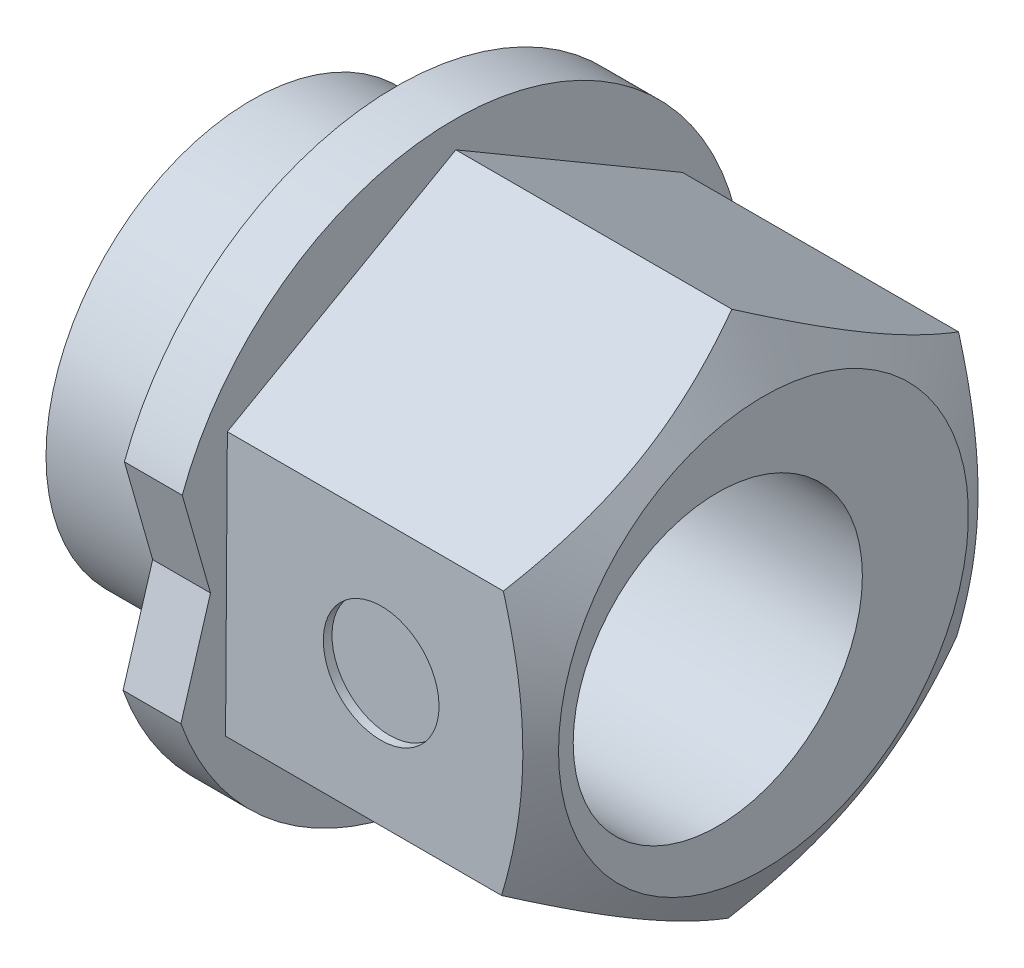
ISO-10303-21;
HEADER;
FILE_DESCRIPTION(('STEP AP214'),'2;1');
FILE_NAME('part.step','',(''),(''),'','','');
FILE_SCHEMA(('AUTOMOTIVE_DESIGN { 1 0 10303 214 1 1 1 1 }'));
ENDSEC;
DATA;
#1=APPLICATION_CONTEXT('core data for automotive mechanical design processes');
#2=APPLICATION_PROTOCOL_DEFINITION('international standard','automotive_design',2000,#1);
#3=PRODUCT_CONTEXT('',#1,'mechanical');
#4=PRODUCT('Part','Part','',(#3));
#5=PRODUCT_RELATED_PRODUCT_CATEGORY('part','',(#4));
#6=PRODUCT_DEFINITION_FORMATION('','',#4);
#7=PRODUCT_DEFINITION_CONTEXT('part definition',#1,'design');
#8=PRODUCT_DEFINITION('design','',#6,#7);
#9=PRODUCT_DEFINITION_SHAPE('','',#8);
#10=(LENGTH_UNIT() NAMED_UNIT(*) SI_UNIT(.MILLI.,.METRE.));
#11=(NAMED_UNIT(*) PLANE_ANGLE_UNIT() SI_UNIT($,.RADIAN.));
#12=(NAMED_UNIT(*) SI_UNIT($,.STERADIAN.) SOLID_ANGLE_UNIT());
#13=UNCERTAINTY_MEASURE_WITH_UNIT(LENGTH_MEASURE(1.E-05),#10,'distance_accuracy_value','');
#14=(GEOMETRIC_REPRESENTATION_CONTEXT(3) GLOBAL_UNCERTAINTY_ASSIGNED_CONTEXT((#13)) GLOBAL_UNIT_ASSIGNED_CONTEXT((#10,
#11,#12)) REPRESENTATION_CONTEXT('',''));
#15=CARTESIAN_POINT('',(0.,0.,0.));
#16=DIRECTION('',(0.,0.,1.));
#17=DIRECTION('',(1.,0.,0.));
#18=AXIS2_PLACEMENT_3D('',#15,#16,#17);
#19=CARTESIAN_POINT('',(5.35,-4.54364126029758,0.0309423828233433));
#20=DIRECTION('',(0.,0.869410264297968,0.494090874569989));
#21=DIRECTION('',(0.,-0.494090874569989,0.869410264297968));
#22=AXIS2_PLACEMENT_3D('',#19,#20,#21);
#23=PLANE('',#22);
#24=DIRECTION('',(0.,0.494090874569989,-0.869410264297968));
#25=VECTOR('',#24,1.);
#26=CARTESIAN_POINT('',(4.77264973081037,-4.54364126029758,0.0309423828233433));
#27=LINE('',#26,#25);
#28=CARTESIAN_POINT('',(4.77264973081037,-4.54364126029758,0.0309423828233433));
#29=VERTEX_POINT('',#28);
#30=CARTESIAN_POINT('',(4.77264973081037,-4.54353714360121,0.0307591774067416));
#31=VERTEX_POINT('',#30);
#32=EDGE_CURVE('E238',#29,#31,#27,.T.);
#33=ORIENTED_EDGE('',*,*,#32,.F.);
#34=DIRECTION('',(-1.,0.,0.));
#35=VECTOR('',#34,1.);
#36=CARTESIAN_POINT('',(5.35,-4.54364126029758,0.0309423828233433));
#37=LINE('',#36,#35);
#38=CARTESIAN_POINT('',(0.,-4.54364126029758,0.0309423828233433));
#39=VERTEX_POINT('',#38);
#40=EDGE_CURVE('E55',#29,#39,#37,.T.);
#41=ORIENTED_EDGE('',*,*,#40,.T.);
#42=DIRECTION('',(0.,0.494090874569989,-0.869410264297968));
#43=VECTOR('',#42,1.);
#44=CARTESIAN_POINT('',(0.,-4.54364126029758,0.0309423828233433));
#45=LINE('',#44,#43);
#46=CARTESIAN_POINT('',(0.,-2.29861751972745,-3.91943756568916));
#47=VERTEX_POINT('',#46);
#48=EDGE_CURVE('E291',#39,#47,#45,.T.);
#49=ORIENTED_EDGE('',*,*,#48,.T.);
#50=DIRECTION('',(-1.,0.,0.));
#51=VECTOR('',#50,1.);
#52=CARTESIAN_POINT('',(5.35,-2.29861751972745,-3.91943756568916));
#53=LINE('',#52,#51);
#54=CARTESIAN_POINT('',(4.77264973081037,-2.29861751972745,-3.91943756568916));
#55=VERTEX_POINT('',#54);
#56=EDGE_CURVE('E260',#55,#47,#53,.T.);
#57=ORIENTED_EDGE('',*,*,#56,.F.);
#58=CARTESIAN_POINT('',(4.77264973081037,-2.29872163642382,-3.91925436027257));
#59=VERTEX_POINT('',#58);
#60=EDGE_CURVE('E240',#59,#55,#27,.T.);
#61=ORIENTED_EDGE('',*,*,#60,.F.);
#62=CARTESIAN_POINT('',(4.77252249257501,-4.5437549214527,0.0311423828233432));
#63=CARTESIAN_POINT('',(4.83018446189932,-4.44509780626388,-0.14245626674864));
#64=CARTESIAN_POINT('',(4.88262583823013,-4.34558908849139,-0.317553409948926));
#65=CARTESIAN_POINT('',(4.97416259753298,-4.14484856970296,-0.67077966138911));
#66=CARTESIAN_POINT('',(5.01322559849631,-4.04361320191933,-0.848915045770918));
#67=CARTESIAN_POINT('',(5.07403259166471,-3.84239708311443,-1.20297817066354));
#68=CARTESIAN_POINT('',(5.09618129094458,-3.74244729091028,-1.3788514355409));
#69=CARTESIAN_POINT('',(5.1226217929783,-3.54207742961478,-1.73142547208403));
#70=CARTESIAN_POINT('',(5.12693549121705,-3.4416580887709,-1.90812496231382));
#71=CARTESIAN_POINT('',(5.11795954206539,-3.2540203419231,-2.23829536511916));
#72=CARTESIAN_POINT('',(5.10687379404681,-3.16677384146384,-2.39181571315104));
#73=CARTESIAN_POINT('',(5.07173908945207,-2.99284924852408,-2.69785622937647));
#74=CARTESIAN_POINT('',(5.04767813181347,-2.90617175757552,-2.85037533910474));
#75=CARTESIAN_POINT('',(4.9875278388602,-2.73188859059485,-3.15704680799033));
#76=CARTESIAN_POINT('',(4.95118353864082,-2.64430497189952,-3.31116035470247));
#77=CARTESIAN_POINT('',(4.86869636125273,-2.47044399379805,-3.61708893323339));
#78=CARTESIAN_POINT('',(4.82257286465198,-2.3841644071245,-3.76890788418783));
#79=CARTESIAN_POINT('',(4.77252249257501,-2.29850385857233,-3.91963756568916));
#80=B_SPLINE_CURVE_WITH_KNOTS('',3,(#62,#63,#64,#65,#66,#67,#68,#69,#70,#71,#72,#73,#74,#75,#76,
#77,#78,#79),.UNSPECIFIED.,.F.,.F.,(4,2,2,2,2,2,2,2,4),(0.,0.623744753764469,1.24898876839455,
1.85875839446027,2.46777920233101,2.99805711762561,3.52882634219932,4.07136862541339,
4.61284557540261),.UNSPECIFIED.);
#81=EDGE_CURVE('E211',#31,#59,#80,.T.);
#82=ORIENTED_EDGE('',*,*,#81,.F.);
#83=EDGE_LOOP('',(#33,#41,#49,#57,#61,#82));
#84=FACE_BOUND('',#83,.T.);
#85=ADVANCED_FACE('F32',(#84),#23,.F.);
#86=CARTESIAN_POINT('',(5.35,-2.29861751972745,-3.91943756568916));
#87=DIRECTION('',(0.,0.00680988299330266,0.999976812477978));
#88=DIRECTION('',(0.,-0.999976812477978,0.00680988299330266));
#89=AXIS2_PLACEMENT_3D('',#86,#87,#88);
#90=PLANE('',#89);
#91=DIRECTION('',(0.,0.999976812477978,-0.00680988299330266));
#92=VECTOR('',#91,1.);
#93=CARTESIAN_POINT('',(4.77264973081037,-2.29861751972745,-3.91943756568916));
#94=LINE('',#93,#92);
#95=CARTESIAN_POINT('',(4.77264973081037,-2.29840680083438,-3.91943900069344));
#96=VERTEX_POINT('',#95);
#97=EDGE_CURVE('E283',#55,#96,#94,.T.);
#98=ORIENTED_EDGE('',*,*,#97,.F.);
#99=ORIENTED_EDGE('',*,*,#56,.T.);
#100=DIRECTION('',(0.,0.999976812477978,-0.00680988299330266));
#101=VECTOR('',#100,1.);
#102=CARTESIAN_POINT('',(0.,-2.29861751972745,-3.91943756568916));
#103=LINE('',#102,#101);
#104=CARTESIAN_POINT('',(0.,2.24502374057014,-3.95037994851252));
#105=VERTEX_POINT('',#104);
#106=EDGE_CURVE('E293',#47,#105,#103,.T.);
#107=ORIENTED_EDGE('',*,*,#106,.T.);
#108=DIRECTION('',(-1.,0.,0.));
#109=VECTOR('',#108,1.);
#110=CARTESIAN_POINT('',(5.35,2.24502374057014,-3.95037994851252));
#111=LINE('',#110,#109);
#112=CARTESIAN_POINT('',(4.77264973081037,2.24502374057014,-3.95037994851252));
#113=VERTEX_POINT('',#112);
#114=EDGE_CURVE('E259',#113,#105,#111,.T.);
#115=ORIENTED_EDGE('',*,*,#114,.F.);
#116=CARTESIAN_POINT('',(4.77264973081037,2.24481302167709,-3.95037851350824));
#117=VERTEX_POINT('',#116);
#118=EDGE_CURVE('E289',#117,#113,#94,.T.);
#119=ORIENTED_EDGE('',*,*,#118,.F.);
#120=CARTESIAN_POINT('',(4.77253116393923,-2.29881751972745,-3.91943620368098));
#121=CARTESIAN_POINT('',(4.83019242109376,-2.09914862844113,-3.92079595699736));
#122=CARTESIAN_POINT('',(4.8826330409757,-1.89775620556924,-3.92216744763432));
#123=CARTESIAN_POINT('',(4.97416823027486,-1.49148410960518,-3.92493417722488));
#124=CARTESIAN_POINT('',(5.01323041867056,-1.28659721815591,-3.92632946533579));
#125=CARTESIAN_POINT('',(5.07403580545695,-0.879362597142383,-3.92910274976131));
#126=CARTESIAN_POINT('',(5.0961837060212,-0.677077522036006,-3.9304803193965));
#127=CARTESIAN_POINT('',(5.12262266428957,-0.271555653578224,-3.93324193990706));
#128=CARTESIAN_POINT('',(5.1269356168253,-0.0683203339816981,-3.93462598074609));
#129=CARTESIAN_POINT('',(5.11795848909764,0.311429419334815,-3.93721209209843));
#130=CARTESIAN_POINT('',(5.10687259675822,0.488000728290139,-3.93841454993441));
#131=CARTESIAN_POINT('',(5.07173828301706,0.839992996868361,-3.94081163168036));
#132=CARTESIAN_POINT('',(5.04767786210512,1.0154127392098,-3.94200624730059));
#133=CARTESIAN_POINT('',(4.98752924463345,1.36813062537293,-3.94440827053197));
#134=CARTESIAN_POINT('',(4.95118610472693,1.54538413189465,-3.94561537416128));
#135=CARTESIAN_POINT('',(4.86870168885514,1.89724759738147,-3.94801157875291));
#136=CARTESIAN_POINT('',(4.8225797912675,2.07186206350711,-3.94920071040918));
#137=CARTESIAN_POINT('',(4.77253116393924,2.24522374057014,-3.9503813105207));
#138=B_SPLINE_CURVE_WITH_KNOTS('',3,(#120,#121,#122,#123,#124,#125,#126,#127,#128,#129,#130,
#131,#132,#133,#134,#135,#136,#137),.UNSPECIFIED.,.F.,.F.,(4,2,2,2,2,2,2,2,4),(0.,
0.62374269709592,1.24898459873569,1.85875236464984,2.46777133481405,2.99803595794767,
3.52879184024593,4.07132007516257,4.6127830764867),.UNSPECIFIED.);
#139=EDGE_CURVE('E207',#96,#117,#138,.T.);
#140=ORIENTED_EDGE('',*,*,#139,.F.);
#141=EDGE_LOOP('',(#98,#99,#107,#115,#119,#140));
#142=FACE_BOUND('',#141,.T.);
#143=ADVANCED_FACE('F216',(#142),#90,.F.);
#144=CARTESIAN_POINT('',(5.35,2.24502374057014,-3.95037994851252));
#145=DIRECTION('',(0.,-0.862600381304665,0.505885937907989));
#146=DIRECTION('',(0.,-0.505885937907989,-0.862600381304665));
#147=AXIS2_PLACEMENT_3D('',#144,#145,#146);
#148=PLANE('',#147);
#149=DIRECTION('',(0.,0.505885937907989,0.862600381304665));
#150=VECTOR('',#149,1.);
#151=CARTESIAN_POINT('',(4.77264973081037,2.24502374057014,-3.95037994851252));
#152=LINE('',#151,#150);
#153=CARTESIAN_POINT('',(4.77264973081037,2.24513034276683,-3.95019817810021));
#154=VERTEX_POINT('',#153);
#155=EDGE_CURVE('E320',#113,#154,#152,.T.);
#156=ORIENTED_EDGE('',*,*,#155,.F.);
#157=ORIENTED_EDGE('',*,*,#114,.T.);
#158=DIRECTION('',(0.,0.505885937907989,0.862600381304665));
#159=VECTOR('',#158,1.);
#160=CARTESIAN_POINT('',(0.,2.24502374057014,-3.95037994851252));
#161=LINE('',#160,#159);
#162=CARTESIAN_POINT('',(0.,4.54364126029758,-0.0309423828233572));
#163=VERTEX_POINT('',#162);
#164=EDGE_CURVE('E296',#105,#163,#161,.T.);
#165=ORIENTED_EDGE('',*,*,#164,.T.);
#166=DIRECTION('',(-1.,0.,0.));
#167=VECTOR('',#166,1.);
#168=CARTESIAN_POINT('',(5.35,4.54364126029758,-0.0309423828233572));
#169=LINE('',#168,#167);
#170=CARTESIAN_POINT('',(4.77264973081037,4.54364126029758,-0.0309423828233572));
#171=VERTEX_POINT('',#170);
#172=EDGE_CURVE('E257',#171,#163,#169,.T.);
#173=ORIENTED_EDGE('',*,*,#172,.F.);
#174=CARTESIAN_POINT('',(4.77264973081037,4.54353465810088,-0.0311241532356663));
#175=VERTEX_POINT('',#174);
#176=EDGE_CURVE('E317',#175,#171,#152,.T.);
#177=ORIENTED_EDGE('',*,*,#176,.F.);
#178=CARTESIAN_POINT('',(4.77252196827759,2.24490644733706,-3.95057994851252));
#179=CARTESIAN_POINT('',(4.83018398066162,2.3459187458398,-3.77834102927067));
#180=CARTESIAN_POINT('',(4.88262540272938,2.4478029766998,-3.60461535357349));
#181=CARTESIAN_POINT('',(4.97416225695894,2.65333565707971,-3.25415578318208));
#182=CARTESIAN_POINT('',(5.01322530705233,2.75698775852406,-3.07741566148852));
#183=CARTESIAN_POINT('',(5.07403239734704,2.96300739344096,-2.72612577118149));
#184=CARTESIAN_POINT('',(5.09618114491948,3.06534322897132,-2.55163005162331));
#185=CARTESIAN_POINT('',(5.12262174029362,3.27049640538847,-2.20181758414277));
#186=CARTESIAN_POINT('',(5.12693548361973,3.37331300063907,-2.02650210762572));
#187=CARTESIAN_POINT('',(5.11795960572909,3.56543023890256,-1.6989175859713));
#188=CARTESIAN_POINT('',(5.10687386643724,3.65475964657023,-1.54659949340975));
#189=CARTESIAN_POINT('',(5.07173913821122,3.83283648365142,-1.2429556558226));
#190=CARTESIAN_POINT('',(5.04767814812076,3.92158329716872,-1.091630960979));
#191=CARTESIAN_POINT('',(4.987527753863,4.10002727102906,-0.787361108114567));
#192=CARTESIAN_POINT('',(4.95118338348752,4.18970184735669,-0.6344544587354));
#193=CARTESIAN_POINT('',(4.86869603912955,4.36771355264578,-0.330921679203984));
#194=CARTESIAN_POINT('',(4.82257244584746,4.45605296206122,-0.180291660585353));
#195=CARTESIAN_POINT('',(4.77252196827759,4.54375855353066,-0.0307423828233579));
#196=B_SPLINE_CURVE_WITH_KNOTS('',3,(#178,#179,#180,#181,#182,#183,#184,#185,#186,#187,#188,
#189,#190,#191,#192,#193,#194,#195),.UNSPECIFIED.,.F.,.F.,(4,2,2,2,2,2,2,2,4),(0.,
0.623744878116952,1.2489890205049,1.85875875904113,2.46777967802528,2.99805839700006,
3.5288284282841,4.07137156089731,4.61284935426144),.UNSPECIFIED.);
#197=EDGE_CURVE('E168',#154,#175,#196,.T.);
#198=ORIENTED_EDGE('',*,*,#197,.F.);
#199=EDGE_LOOP('',(#156,#157,#165,#173,#177,#198));
#200=FACE_BOUND('',#199,.T.);
#201=ADVANCED_FACE('F219',(#200),#148,.F.);
#202=CARTESIAN_POINT('',(5.35,4.54364126029758,-0.0309423828233572));
#203=DIRECTION('',(0.,-0.869410264297969,-0.494090874569989));
#204=DIRECTION('',(0.,0.494090874569989,-0.869410264297969));
#205=AXIS2_PLACEMENT_3D('',#202,#203,#204);
#206=PLANE('',#205);
#207=DIRECTION('',(0.,-0.494090874569989,0.869410264297969));
#208=VECTOR('',#207,1.);
#209=CARTESIAN_POINT('',(4.77264973081037,4.54364126029758,-0.0309423828233572));
#210=LINE('',#209,#208);
#211=CARTESIAN_POINT('',(4.77264973081037,4.54353714360121,-0.030759177406767));
#212=VERTEX_POINT('',#211);
#213=EDGE_CURVE('E313',#171,#212,#210,.T.);
#214=ORIENTED_EDGE('',*,*,#213,.F.);
#215=ORIENTED_EDGE('',*,*,#172,.T.);
#216=DIRECTION('',(0.,-0.494090874569989,0.869410264297968));
#217=VECTOR('',#216,1.);
#218=CARTESIAN_POINT('',(0.,4.54364126029758,-0.0309423828233572));
#219=LINE('',#218,#217);
#220=CARTESIAN_POINT('',(0.,2.29861751972744,3.91943756568916));
#221=VERTEX_POINT('',#220);
#222=EDGE_CURVE('E305',#163,#221,#219,.T.);
#223=ORIENTED_EDGE('',*,*,#222,.T.);
#224=DIRECTION('',(-1.,0.,0.));
#225=VECTOR('',#224,1.);
#226=CARTESIAN_POINT('',(5.35,2.29861751972744,3.91943756568916));
#227=LINE('',#226,#225);
#228=CARTESIAN_POINT('',(4.77264973081037,2.29861751972744,3.91943756568916));
#229=VERTEX_POINT('',#228);
#230=EDGE_CURVE('E250',#229,#221,#227,.T.);
#231=ORIENTED_EDGE('',*,*,#230,.F.);
#232=CARTESIAN_POINT('',(4.77264973081037,2.2987216364238,3.91925436027258));
#233=VERTEX_POINT('',#232);
#234=EDGE_CURVE('E145',#233,#229,#210,.T.);
#235=ORIENTED_EDGE('',*,*,#234,.F.);
#236=CARTESIAN_POINT('',(4.77252249257501,4.5437549214527,-0.031142382823357));
#237=CARTESIAN_POINT('',(4.83018446189932,4.44509780626387,0.142456266748626));
#238=CARTESIAN_POINT('',(4.88262583823013,4.34558908849138,0.317553409948912));
#239=CARTESIAN_POINT('',(4.97416259753299,4.14484856970295,0.670779661389096));
#240=CARTESIAN_POINT('',(5.01322559849631,4.04361320191932,0.848915045770903));
#241=CARTESIAN_POINT('',(5.07403259166472,3.84239708311442,1.20297817066352));
#242=CARTESIAN_POINT('',(5.09618129094458,3.74244729091027,1.37885143554089));
#243=CARTESIAN_POINT('',(5.1226217929783,3.54207742961477,1.73142547208402));
#244=CARTESIAN_POINT('',(5.12693549121706,3.4416580887709,1.9081249623138));
#245=CARTESIAN_POINT('',(5.1179595420654,3.2540203419231,2.23829536511915));
#246=CARTESIAN_POINT('',(5.10687379404682,3.16677384146383,2.39181571315103));
#247=CARTESIAN_POINT('',(5.07173908945208,2.99284924852407,2.69785622937646));
#248=CARTESIAN_POINT('',(5.04767813181348,2.90617175757551,2.85037533910472));
#249=CARTESIAN_POINT('',(4.9875278388602,2.73188859059484,3.15704680799032));
#250=CARTESIAN_POINT('',(4.95118353864083,2.64430497189951,3.31116035470246));
#251=CARTESIAN_POINT('',(4.86869636125274,2.47044399379804,3.61708893323339));
#252=CARTESIAN_POINT('',(4.82257286465199,2.38416440712448,3.76890788418783));
#253=CARTESIAN_POINT('',(4.77252249257501,2.29850385857232,3.91963756568916));
#254=B_SPLINE_CURVE_WITH_KNOTS('',3,(#236,#237,#238,#239,#240,#241,#242,#243,#244,#245,#246,
#247,#248,#249,#250,#251,#252,#253),.UNSPECIFIED.,.F.,.F.,(4,2,2,2,2,2,2,2,4),(0.,
0.623744753764469,1.24898876839455,1.85875839446027,2.46777920233101,2.99805711762561,
3.52882634219932,4.0713686254134,4.61284557540263),.UNSPECIFIED.);
#255=EDGE_CURVE('E158',#212,#233,#254,.T.);
#256=ORIENTED_EDGE('',*,*,#255,.F.);
#257=EDGE_LOOP('',(#214,#215,#223,#231,#235,#256));
#258=FACE_BOUND('',#257,.T.);
#259=ADVANCED_FACE('F223',(#258),#206,.F.);
#260=CARTESIAN_POINT('',(5.35,2.29861751972744,3.91943756568916));
#261=DIRECTION('',(0.,-0.00680988299330344,-0.999976812477978));
#262=DIRECTION('',(0.,0.999976812477978,-0.00680988299330344));
#263=AXIS2_PLACEMENT_3D('',#260,#261,#262);
#264=PLANE('',#263);
#265=CARTESIAN_POINT('',(2.675,0.0267968895786493,3.93490875710084));
#266=DIRECTION('',(0.,-0.00680988299330344,-0.999976812477978));
#267=DIRECTION('',(0.,0.999976812477978,-0.00680988299330344));
#268=AXIS2_PLACEMENT_3D('',#265,#266,#267);
#269=CIRCLE('',#268,0.999999999999998);
#270=CARTESIAN_POINT('',(2.675,-0.973179922899327,3.94171864009414));
#271=VERTEX_POINT('',#270);
#272=EDGE_CURVE('E327',#271,#271,#269,.T.);
#273=ORIENTED_EDGE('',*,*,#272,.T.);
#274=EDGE_LOOP('',(#273));
#275=FACE_BOUND('',#274,.T.);
#276=DIRECTION('',(0.,-0.999976812477978,0.00680988299330344));
#277=VECTOR('',#276,1.);
#278=CARTESIAN_POINT('',(4.77264973081037,2.29861751972744,3.91943756568916));
#279=LINE('',#278,#277);
#280=CARTESIAN_POINT('',(4.77264973081037,2.29840680083438,3.91943900069344));
#281=VERTEX_POINT('',#280);
#282=EDGE_CURVE('E140',#229,#281,#279,.T.);
#283=ORIENTED_EDGE('',*,*,#282,.F.);
#284=ORIENTED_EDGE('',*,*,#230,.T.);
#285=DIRECTION('',(0.,-0.999976812477978,0.00680988299330344));
#286=VECTOR('',#285,1.);
#287=CARTESIAN_POINT('',(0.,2.29861751972744,3.91943756568916));
#288=LINE('',#287,#286);
#289=CARTESIAN_POINT('',(0.,-2.24502374057014,3.95037994851252));
#290=VERTEX_POINT('',#289);
#291=EDGE_CURVE('E252',#221,#290,#288,.T.);
#292=ORIENTED_EDGE('',*,*,#291,.T.);
#293=DIRECTION('',(-1.,0.,0.));
#294=VECTOR('',#293,1.);
#295=CARTESIAN_POINT('',(5.35,-2.24502374057014,3.95037994851252));
#296=LINE('',#295,#294);
#297=CARTESIAN_POINT('',(4.77264973081037,-2.24502374057014,3.95037994851252));
#298=VERTEX_POINT('',#297);
#299=EDGE_CURVE('E248',#298,#290,#296,.T.);
#300=ORIENTED_EDGE('',*,*,#299,.F.);
#301=CARTESIAN_POINT('',(4.77264973081037,-2.24481302167709,3.95037851350824));
#302=VERTEX_POINT('',#301);
#303=EDGE_CURVE('E149',#302,#298,#279,.T.);
#304=ORIENTED_EDGE('',*,*,#303,.F.);
#305=CARTESIAN_POINT('',(4.77253116393924,2.29881751972744,3.91943620368098));
#306=CARTESIAN_POINT('',(4.83019242109376,2.09914862844111,3.92079595699735));
#307=CARTESIAN_POINT('',(4.88263304097571,1.89775620556923,3.92216744763432));
#308=CARTESIAN_POINT('',(4.97416823027487,1.49148410960517,3.92493417722488));
#309=CARTESIAN_POINT('',(5.01323041867056,1.2865972181559,3.92632946533578));
#310=CARTESIAN_POINT('',(5.07403580545695,0.879362597142374,3.9291027497613));
#311=CARTESIAN_POINT('',(5.0961837060212,0.677077522035997,3.9304803193965));
#312=CARTESIAN_POINT('',(5.12262266428957,0.271555653578215,3.93324193990705));
#313=CARTESIAN_POINT('',(5.1269356168253,0.0683203339816897,3.93462598074609));
#314=CARTESIAN_POINT('',(5.11795848909764,-0.311429419334822,3.93721209209843));
#315=CARTESIAN_POINT('',(5.10687259675822,-0.488000728290145,3.9384145499344));
#316=CARTESIAN_POINT('',(5.07173828301706,-0.839992996868366,3.94081163168035));
#317=CARTESIAN_POINT('',(5.04767786210512,-1.0154127392098,3.94200624730059));
#318=CARTESIAN_POINT('',(4.98752924463345,-1.36813062537293,3.94440827053197));
#319=CARTESIAN_POINT('',(4.95118610472693,-1.54538413189465,3.94561537416128));
#320=CARTESIAN_POINT('',(4.86870168885514,-1.89724759738148,3.94801157875291));
#321=CARTESIAN_POINT('',(4.8225797912675,-2.07186206350711,3.94920071040918));
#322=CARTESIAN_POINT('',(4.77253116393924,-2.24522374057014,3.9503813105207));
#323=B_SPLINE_CURVE_WITH_KNOTS('',3,(#305,#306,#307,#308,#309,#310,#311,#312,#313,#314,#315,
#316,#317,#318,#319,#320,#321,#322),.UNSPECIFIED.,.F.,.F.,(4,2,2,2,2,2,2,2,4),(0.,
0.623742697095919,1.24898459873569,1.85875236464984,2.46777133481404,2.99803595794766,
3.52879184024592,4.07132007516255,4.61278307648668),.UNSPECIFIED.);
#324=EDGE_CURVE('E154',#281,#302,#323,.T.);
#325=ORIENTED_EDGE('',*,*,#324,.F.);
#326=EDGE_LOOP('',(#283,#284,#292,#300,#304,#325));
#327=FACE_BOUND('',#326,.T.);
#328=ADVANCED_FACE('F164',(#275,#327),#264,.F.);
#329=CARTESIAN_POINT('',(5.35,-2.24502374057014,3.95037994851252));
#330=DIRECTION('',(0.,0.862600381304665,-0.50588593790799));
#331=DIRECTION('',(0.,0.50588593790799,0.862600381304665));
#332=AXIS2_PLACEMENT_3D('',#329,#330,#331);
#333=PLANE('',#332);
#334=DIRECTION('',(0.,-0.50588593790799,-0.862600381304665));
#335=VECTOR('',#334,1.);
#336=CARTESIAN_POINT('',(4.77264973081037,-2.24502374057014,3.95037994851252));
#337=LINE('',#336,#335);
#338=CARTESIAN_POINT('',(4.77264973081037,-2.24513034276683,3.95019817810021));
#339=VERTEX_POINT('',#338);
#340=EDGE_CURVE('E11',#298,#339,#337,.T.);
#341=ORIENTED_EDGE('',*,*,#340,.F.);
#342=ORIENTED_EDGE('',*,*,#299,.T.);
#343=DIRECTION('',(0.,-0.50588593790799,-0.862600381304665));
#344=VECTOR('',#343,1.);
#345=CARTESIAN_POINT('',(0.,-2.24502374057014,3.95037994851252));
#346=LINE('',#345,#344);
#347=EDGE_CURVE('E247',#290,#39,#346,.T.);
#348=ORIENTED_EDGE('',*,*,#347,.T.);
#349=ORIENTED_EDGE('',*,*,#40,.F.);
#350=CARTESIAN_POINT('',(4.77264973081037,-4.54353465810089,0.0311241532356659));
#351=VERTEX_POINT('',#350);
#352=EDGE_CURVE('E36',#351,#29,#337,.T.);
#353=ORIENTED_EDGE('',*,*,#352,.F.);
#354=CARTESIAN_POINT('',(4.77252196827759,-2.24490644733706,3.95057994851252));
#355=CARTESIAN_POINT('',(4.83018398066162,-2.34591874583979,3.77834102927067));
#356=CARTESIAN_POINT('',(4.88262540272938,-2.44780297669979,3.60461535357349));
#357=CARTESIAN_POINT('',(4.97416225695894,-2.65333565707971,3.25415578318208));
#358=CARTESIAN_POINT('',(5.01322530705233,-2.75698775852406,3.07741566148852));
#359=CARTESIAN_POINT('',(5.07403239734704,-2.96300739344096,2.72612577118149));
#360=CARTESIAN_POINT('',(5.09618114491948,-3.06534322897131,2.55163005162331));
#361=CARTESIAN_POINT('',(5.12262174029362,-3.27049640538847,2.20181758414277));
#362=CARTESIAN_POINT('',(5.12693548361973,-3.37331300063907,2.02650210762572));
#363=CARTESIAN_POINT('',(5.11795960572909,-3.56543023890256,1.6989175859713));
#364=CARTESIAN_POINT('',(5.10687386643724,-3.65475964657023,1.54659949340975));
#365=CARTESIAN_POINT('',(5.07173913821122,-3.83283648365142,1.2429556558226));
#366=CARTESIAN_POINT('',(5.04767814812075,-3.92158329716872,1.09163096097899));
#367=CARTESIAN_POINT('',(4.987527753863,-4.10002727102906,0.787361108114558));
#368=CARTESIAN_POINT('',(4.95118338348752,-4.18970184735669,0.634454458735391));
#369=CARTESIAN_POINT('',(4.86869603912954,-4.36771355264579,0.330921679203973));
#370=CARTESIAN_POINT('',(4.82257244584746,-4.45605296206123,0.18029166058534));
#371=CARTESIAN_POINT('',(4.77252196827758,-4.54375855353067,0.0307423828233436));
#372=B_SPLINE_CURVE_WITH_KNOTS('',3,(#354,#355,#356,#357,#358,#359,#360,#361,#362,#363,#364,
#365,#366,#367,#368,#369,#370,#371),.UNSPECIFIED.,.F.,.F.,(4,2,2,2,2,2,2,2,4),(0.,
0.623744878116952,1.2489890205049,1.85875875904113,2.46777967802528,2.99805839700007,
3.52882842828411,4.07137156089733,4.61284935426146),.UNSPECIFIED.);
#373=EDGE_CURVE('E166',#339,#351,#372,.T.);
#374=ORIENTED_EDGE('',*,*,#373,.F.);
#375=EDGE_LOOP('',(#341,#342,#348,#349,#353,#374));
#376=FACE_BOUND('',#375,.T.);
#377=ADVANCED_FACE('F231',(#376),#333,.F.);
#378=CARTESIAN_POINT('',(5.35,0.,0.));
#379=DIRECTION('',(1.,0.,0.));
#380=DIRECTION('',(0.,0.,-1.));
#381=AXIS2_PLACEMENT_3D('',#378,#379,#380);
#382=PLANE('',#381);
#383=CARTESIAN_POINT('',(5.35,0.,0.79));
#384=DIRECTION('',(-1.,0.,0.));
#385=DIRECTION('',(0.,0.,1.));
#386=AXIS2_PLACEMENT_3D('',#383,#384,#385);
#387=CIRCLE('',#386,2.5);
#388=CARTESIAN_POINT('',(5.35,0.,3.29));
#389=VERTEX_POINT('',#388);
#390=EDGE_CURVE('E324',#389,#389,#387,.T.);
#391=ORIENTED_EDGE('',*,*,#390,.T.);
#392=EDGE_LOOP('',(#391));
#393=FACE_BOUND('',#392,.T.);
#394=CARTESIAN_POINT('',(5.35,0.,0.));
#395=DIRECTION('',(-1.,0.,0.));
#396=DIRECTION('',(0.,0.,1.));
#397=AXIS2_PLACEMENT_3D('',#394,#395,#396);
#398=CIRCLE('',#397,3.54364126029758);
#399=CARTESIAN_POINT('',(5.35,0.,3.54364126029758));
#400=VERTEX_POINT('',#399);
#401=EDGE_CURVE('E159',#400,#400,#398,.T.);
#402=ORIENTED_EDGE('',*,*,#401,.F.);
#403=EDGE_LOOP('',(#402));
#404=FACE_BOUND('',#403,.T.);
#405=ADVANCED_FACE('F384',(#393,#404),#382,.T.);
#406=CARTESIAN_POINT('',(0.,0.,0.));
#407=DIRECTION('',(-1.,0.,0.));
#408=DIRECTION('',(0.,0.,1.));
#409=AXIS2_PLACEMENT_3D('',#406,#407,#408);
#410=PLANE('',#409);
#411=CARTESIAN_POINT('',(0.,0.,0.));
#412=DIRECTION('',(-1.,0.,0.));
#413=DIRECTION('',(0.,0.,1.));
#414=AXIS2_PLACEMENT_3D('',#411,#412,#413);
#415=CIRCLE('',#414,5.01);
#416=CARTESIAN_POINT('',(0.,1.73708093898426,4.69921799998868));
#417=VERTEX_POINT('',#416);
#418=CARTESIAN_POINT('',(0.,-1.67291906101574,4.72244023946203));
#419=VERTEX_POINT('',#418);
#420=EDGE_CURVE('E339',#417,#419,#415,.T.);
#421=ORIENTED_EDGE('',*,*,#420,.F.);
#422=DIRECTION('',(0.,0.961485049323104,0.274857235539013));
#423=VECTOR('',#422,1.);
#424=CARTESIAN_POINT('',(0.,1.73708093898426,4.69921799998868));
#425=LINE('',#424,#423);
#426=CARTESIAN_POINT('',(0.,0.0286759974876035,4.21084071348636));
#427=VERTEX_POINT('',#426);
#428=EDGE_CURVE('E346',#427,#417,#425,.T.);
#429=ORIENTED_EDGE('',*,*,#428,.F.);
#430=DIRECTION('',(0.,0.957652468108509,-0.287926640527897));
#431=VECTOR('',#430,1.);
#432=CARTESIAN_POINT('',(0.,0.0286759974876035,4.21084071348636));
#433=LINE('',#432,#431);
#434=EDGE_CURVE('E353',#419,#427,#433,.T.);
#435=ORIENTED_EDGE('',*,*,#434,.F.);
#436=EDGE_LOOP('',(#421,#429,#435));
#437=FACE_BOUND('',#436,.T.);
#438=ORIENTED_EDGE('',*,*,#106,.F.);
#439=ORIENTED_EDGE('',*,*,#48,.F.);
#440=ORIENTED_EDGE('',*,*,#347,.F.);
#441=ORIENTED_EDGE('',*,*,#291,.F.);
#442=ORIENTED_EDGE('',*,*,#222,.F.);
#443=ORIENTED_EDGE('',*,*,#164,.F.);
#444=EDGE_LOOP('',(#438,#439,#440,#441,#442,#443));
#445=FACE_BOUND('',#444,.T.);
#446=ADVANCED_FACE('F310',(#437,#445),#410,.F.);
#447=CARTESIAN_POINT('',(-1.,0.,0.));
#448=DIRECTION('',(1.,0.,0.));
#449=DIRECTION('',(0.,0.,-1.));
#450=AXIS2_PLACEMENT_3D('',#447,#448,#449);
#451=CYLINDRICAL_SURFACE('',#450,5.01);
#452=ORIENTED_EDGE('',*,*,#420,.T.);
#453=DIRECTION('',(1.,0.,0.));
#454=VECTOR('',#453,1.);
#455=CARTESIAN_POINT('',(-1.,-1.67291906101574,4.72244023946203));
#456=LINE('',#455,#454);
#457=CARTESIAN_POINT('',(-1.,-1.67291906101574,4.72244023946203));
#458=VERTEX_POINT('',#457);
#459=EDGE_CURVE('E294',#458,#419,#456,.T.);
#460=ORIENTED_EDGE('',*,*,#459,.F.);
#461=CARTESIAN_POINT('',(-1.,0.,0.));
#462=DIRECTION('',(-1.,0.,0.));
#463=DIRECTION('',(0.,0.,1.));
#464=AXIS2_PLACEMENT_3D('',#461,#462,#463);
#465=CIRCLE('',#464,5.01);
#466=CARTESIAN_POINT('',(-1.,1.73708093898426,4.69921799998868));
#467=VERTEX_POINT('',#466);
#468=EDGE_CURVE('E342',#467,#458,#465,.T.);
#469=ORIENTED_EDGE('',*,*,#468,.F.);
#470=DIRECTION('',(1.,0.,0.));
#471=VECTOR('',#470,1.);
#472=CARTESIAN_POINT('',(-1.,1.73708093898426,4.69921799998868));
#473=LINE('',#472,#471);
#474=EDGE_CURVE('E350',#467,#417,#473,.T.);
#475=ORIENTED_EDGE('',*,*,#474,.T.);
#476=EDGE_LOOP('',(#452,#460,#469,#475));
#477=FACE_BOUND('',#476,.T.);
#478=ADVANCED_FACE('F369',(#477),#451,.T.);
#479=CARTESIAN_POINT('',(-1.,0.0286759974876035,4.21084071348636));
#480=DIRECTION('',(0.,-0.287926640527897,-0.957652468108509));
#481=DIRECTION('',(0.,0.957652468108509,-0.287926640527897));
#482=AXIS2_PLACEMENT_3D('',#479,#480,#481);
#483=PLANE('',#482);
#484=ORIENTED_EDGE('',*,*,#434,.T.);
#485=DIRECTION('',(1.,0.,0.));
#486=VECTOR('',#485,1.);
#487=CARTESIAN_POINT('',(-1.,0.0286759974876035,4.21084071348636));
#488=LINE('',#487,#486);
#489=CARTESIAN_POINT('',(-1.,0.0286759974876035,4.21084071348636));
#490=VERTEX_POINT('',#489);
#491=EDGE_CURVE('E299',#490,#427,#488,.T.);
#492=ORIENTED_EDGE('',*,*,#491,.F.);
#493=DIRECTION('',(0.,0.957652468108509,-0.287926640527897));
#494=VECTOR('',#493,1.);
#495=CARTESIAN_POINT('',(-1.,0.0286759974876035,4.21084071348636));
#496=LINE('',#495,#494);
#497=EDGE_CURVE('E345',#458,#490,#496,.T.);
#498=ORIENTED_EDGE('',*,*,#497,.F.);
#499=ORIENTED_EDGE('',*,*,#459,.T.);
#500=EDGE_LOOP('',(#484,#492,#498,#499));
#501=FACE_BOUND('',#500,.T.);
#502=ADVANCED_FACE('F373',(#501),#483,.F.);
#503=CARTESIAN_POINT('',(-1.,1.73708093898426,4.69921799998868));
#504=DIRECTION('',(0.,0.274857235539013,-0.961485049323104));
#505=DIRECTION('',(0.,0.961485049323104,0.274857235539013));
#506=AXIS2_PLACEMENT_3D('',#503,#504,#505);
#507=PLANE('',#506);
#508=ORIENTED_EDGE('',*,*,#428,.T.);
#509=ORIENTED_EDGE('',*,*,#474,.F.);
#510=DIRECTION('',(0.,0.961485049323104,0.274857235539013));
#511=VECTOR('',#510,1.);
#512=CARTESIAN_POINT('',(-1.,1.73708093898426,4.69921799998868));
#513=LINE('',#512,#511);
#514=EDGE_CURVE('E348',#490,#467,#513,.T.);
#515=ORIENTED_EDGE('',*,*,#514,.F.);
#516=ORIENTED_EDGE('',*,*,#491,.T.);
#517=EDGE_LOOP('',(#508,#509,#515,#516));
#518=FACE_BOUND('',#517,.T.);
#519=ADVANCED_FACE('F362',(#518),#507,.F.);
#520=CARTESIAN_POINT('',(-1.,0.,0.));
#521=DIRECTION('',(-1.,0.,0.));
#522=DIRECTION('',(0.,0.,1.));
#523=AXIS2_PLACEMENT_3D('',#520,#521,#522);
#524=PLANE('',#523);
#525=CARTESIAN_POINT('',(-1.,0.,0.));
#526=DIRECTION('',(-1.,0.,0.));
#527=DIRECTION('',(0.,0.,1.));
#528=AXIS2_PLACEMENT_3D('',#525,#526,#527);
#529=CIRCLE('',#528,3.555);
#530=CARTESIAN_POINT('',(-1.,0.,3.555));
#531=VERTEX_POINT('',#530);
#532=EDGE_CURVE('E333',#531,#531,#529,.T.);
#533=ORIENTED_EDGE('',*,*,#532,.F.);
#534=EDGE_LOOP('',(#533));
#535=FACE_BOUND('',#534,.T.);
#536=ORIENTED_EDGE('',*,*,#468,.T.);
#537=ORIENTED_EDGE('',*,*,#497,.T.);
#538=ORIENTED_EDGE('',*,*,#514,.T.);
#539=EDGE_LOOP('',(#536,#537,#538));
#540=FACE_BOUND('',#539,.T.);
#541=ADVANCED_FACE('F372',(#535,#540),#524,.T.);
#542=CARTESIAN_POINT('',(-3.5,0.,0.));
#543=DIRECTION('',(1.,0.,0.));
#544=DIRECTION('',(0.,0.,-1.));
#545=AXIS2_PLACEMENT_3D('',#542,#543,#544);
#546=CYLINDRICAL_SURFACE('',#545,3.555);
#547=CARTESIAN_POINT('',(-3.5,0.,0.));
#548=DIRECTION('',(-1.,0.,0.));
#549=DIRECTION('',(0.,0.,1.));
#550=AXIS2_PLACEMENT_3D('',#547,#548,#549);
#551=CIRCLE('',#550,3.555);
#552=CARTESIAN_POINT('',(-3.5,0.,3.555));
#553=VERTEX_POINT('',#552);
#554=EDGE_CURVE('E336',#553,#553,#551,.T.);
#555=ORIENTED_EDGE('',*,*,#554,.F.);
#556=EDGE_LOOP('',(#555));
#557=FACE_BOUND('',#556,.T.);
#558=ORIENTED_EDGE('',*,*,#532,.T.);
#559=EDGE_LOOP('',(#558));
#560=FACE_BOUND('',#559,.T.);
#561=ADVANCED_FACE('F425',(#557,#560),#546,.T.);
#562=CARTESIAN_POINT('',(-3.5,0.,0.));
#563=DIRECTION('',(-1.,0.,0.));
#564=DIRECTION('',(0.,0.,1.));
#565=AXIS2_PLACEMENT_3D('',#562,#563,#564);
#566=PLANE('',#565);
#567=CARTESIAN_POINT('',(-3.5,0.,0.79));
#568=DIRECTION('',(-1.,0.,0.));
#569=DIRECTION('',(0.,0.,1.));
#570=AXIS2_PLACEMENT_3D('',#567,#568,#569);
#571=CIRCLE('',#570,2.5);
#572=CARTESIAN_POINT('',(-3.5,0.,3.29));
#573=VERTEX_POINT('',#572);
#574=EDGE_CURVE('E286',#573,#573,#571,.T.);
#575=ORIENTED_EDGE('',*,*,#574,.F.);
#576=EDGE_LOOP('',(#575));
#577=FACE_BOUND('',#576,.T.);
#578=ORIENTED_EDGE('',*,*,#554,.T.);
#579=EDGE_LOOP('',(#578));
#580=FACE_BOUND('',#579,.T.);
#581=ADVANCED_FACE('F435',(#577,#580),#566,.T.);
#582=CARTESIAN_POINT('',(2.675,0.0257754071296538,3.78491223522914));
#583=DIRECTION('',(0.,0.00680988299330344,0.999976812477978));
#584=DIRECTION('',(0.,-0.999976812477978,0.00680988299330344));
#585=AXIS2_PLACEMENT_3D('',#582,#583,#584);
#586=CYLINDRICAL_SURFACE('',#585,0.999999999999998);
#587=CARTESIAN_POINT('',(2.675,0.0257754071296538,3.78491223522914));
#588=DIRECTION('',(0.,-0.00680988299330344,-0.999976812477978));
#589=DIRECTION('',(0.,0.999976812477978,-0.00680988299330344));
#590=AXIS2_PLACEMENT_3D('',#587,#588,#589);
#591=CIRCLE('',#590,0.999999999999998);
#592=CARTESIAN_POINT('',(2.675,-0.974201405348323,3.79172211822245));
#593=VERTEX_POINT('',#592);
#594=EDGE_CURVE('E330',#593,#593,#591,.T.);
#595=CARTESIAN_POINT('',(2.675,-0.974201405348323,3.79172211822245));
#596=CARTESIAN_POINT('',(2.675,-0.974190764906146,3.79328458199194));
#597=CARTESIAN_POINT('',(2.675,-0.974180124463969,3.79484704576144));
#598=CARTESIAN_POINT('',(2.675,-0.974158843579614,3.79797197330043));
#599=CARTESIAN_POINT('',(2.675,-0.974148203137438,3.79953443706993));
#600=CARTESIAN_POINT('',(2.675,-0.974126922253083,3.80265936460892));
#601=CARTESIAN_POINT('',(2.675,-0.974116281810906,3.80422182837842));
#602=CARTESIAN_POINT('',(2.675,-0.974095000926552,3.80734675591741));
#603=CARTESIAN_POINT('',(2.675,-0.974084360484375,3.80890921968691));
#604=CARTESIAN_POINT('',(2.675,-0.974063079600021,3.8120341472259));
#605=CARTESIAN_POINT('',(2.675,-0.974052439157844,3.8135966109954));
#606=CARTESIAN_POINT('',(2.675,-0.97403115827349,3.8167215385344));
#607=CARTESIAN_POINT('',(2.675,-0.974020517831313,3.81828400230389));
#608=CARTESIAN_POINT('',(2.675,-0.973999236946959,3.82140892984289));
#609=CARTESIAN_POINT('',(2.675,-0.973988596504782,3.82297139361238));
#610=CARTESIAN_POINT('',(2.675,-0.973967315620428,3.82609632115138));
#611=CARTESIAN_POINT('',(2.675,-0.973956675178251,3.82765878492087));
#612=CARTESIAN_POINT('',(2.675,-0.973935394293897,3.83078371245987));
#613=CARTESIAN_POINT('',(2.675,-0.97392475385172,3.83234617622936));
#614=CARTESIAN_POINT('',(2.675,-0.973903472967366,3.83547110376836));
#615=CARTESIAN_POINT('',(2.675,-0.973892832525189,3.83703356753785));
#616=CARTESIAN_POINT('',(2.675,-0.973871551640834,3.84015849507685));
#617=CARTESIAN_POINT('',(2.675,-0.973860911198657,3.84172095884634));
#618=CARTESIAN_POINT('',(2.675,-0.973839630314303,3.84484588638534));
#619=CARTESIAN_POINT('',(2.675,-0.973828989872126,3.84640835015484));
#620=CARTESIAN_POINT('',(2.675,-0.973807708987772,3.84953327769383));
#621=CARTESIAN_POINT('',(2.675,-0.973797068545595,3.85109574146333));
#622=CARTESIAN_POINT('',(2.675,-0.973775787661241,3.85422066900232));
#623=CARTESIAN_POINT('',(2.675,-0.973765147219064,3.85578313277182));
#624=CARTESIAN_POINT('',(2.675,-0.97374386633471,3.85890806031081));
#625=CARTESIAN_POINT('',(2.675,-0.973733225892533,3.86047052408031));
#626=CARTESIAN_POINT('',(2.675,-0.973711945008179,3.8635954516193));
#627=CARTESIAN_POINT('',(2.675,-0.973701304566002,3.8651579153888));
#628=CARTESIAN_POINT('',(2.675,-0.973680023681648,3.86828284292779));
#629=CARTESIAN_POINT('',(2.675,-0.973669383239471,3.86984530669729));
#630=CARTESIAN_POINT('',(2.675,-0.973648102355117,3.87297023423628));
#631=CARTESIAN_POINT('',(2.675,-0.97363746191294,3.87453269800578));
#632=CARTESIAN_POINT('',(2.675,-0.973616181028586,3.87765762554477));
#633=CARTESIAN_POINT('',(2.675,-0.973605540586409,3.87922008931427));
#634=CARTESIAN_POINT('',(2.675,-0.973584259702054,3.88234501685326));
#635=CARTESIAN_POINT('',(2.675,-0.973573619259878,3.88390748062276));
#636=CARTESIAN_POINT('',(2.675,-0.973552338375523,3.88703240816175));
#637=CARTESIAN_POINT('',(2.675,-0.973541697933347,3.88859487193125));
#638=CARTESIAN_POINT('',(2.675,-0.973520417048992,3.89171979947024));
#639=CARTESIAN_POINT('',(2.675,-0.973509776606815,3.89328226323974));
#640=CARTESIAN_POINT('',(2.675,-0.973488495722461,3.89640719077873));
#641=CARTESIAN_POINT('',(2.675,-0.973477855280284,3.89796965454823));
#642=CARTESIAN_POINT('',(2.675,-0.97345657439593,3.90109458208722));
#643=CARTESIAN_POINT('',(2.675,-0.973445933953753,3.90265704585672));
#644=CARTESIAN_POINT('',(2.675,-0.973424653069399,3.90578197339572));
#645=CARTESIAN_POINT('',(2.675,-0.973414012627222,3.90734443716521));
#646=CARTESIAN_POINT('',(2.675,-0.973392731742868,3.91046936470421));
#647=CARTESIAN_POINT('',(2.675,-0.973382091300691,3.9120318284737));
#648=CARTESIAN_POINT('',(2.675,-0.973360810416337,3.9151567560127));
#649=CARTESIAN_POINT('',(2.675,-0.97335016997416,3.91671921978219));
#650=CARTESIAN_POINT('',(2.675,-0.973328889089806,3.91984414732119));
#651=CARTESIAN_POINT('',(2.675,-0.973318248647629,3.92140661109068));
#652=CARTESIAN_POINT('',(2.675,-0.973296967763274,3.92453153862968));
#653=CARTESIAN_POINT('',(2.675,-0.973286327321098,3.92609400239917));
#654=CARTESIAN_POINT('',(2.675,-0.973265046436743,3.92921892993817));
#655=CARTESIAN_POINT('',(2.675,-0.973254405994566,3.93078139370766));
#656=CARTESIAN_POINT('',(2.675,-0.973233125110212,3.93390632124666));
#657=CARTESIAN_POINT('',(2.675,-0.973222484668035,3.93546878501616));
#658=CARTESIAN_POINT('',(2.675,-0.973201203783681,3.93859371255515));
#659=CARTESIAN_POINT('',(2.675,-0.973190563341504,3.94015617632465));
#660=CARTESIAN_POINT('',(2.675,-0.973179922899327,3.94171864009414));
#661=B_SPLINE_CURVE_WITH_KNOTS('',3,(#595,#596,#597,#598,#599,#600,#601,#602,#603,#604,#605,
#606,#607,#608,#609,#610,#611,#612,#613,#614,#615,#616,#617,#618,#619,#620,#621,#622,#623,#624,
#625,#626,#627,#628,#629,#630,#631,#632,#633,#634,#635,#636,#637,#638,#639,#640,#641,#642,#643,
#644,#645,#646,#647,#648,#649,#650,#651,#652,#653,#654,#655,#656,#657,#658,#659,#660),
.UNSPECIFIED.,.F.,.F.,(4,2,2,2,2,2,2,2,2,2,2,2,2,2,2,2,2,2,2,2,2,2,2,2,2,2,2,2,2,2,2,2,4),(0.,
0.00468750000000004,0.00937500000000009,0.0140625000000001,0.0187500000000002,
0.0234375000000002,0.0281250000000003,0.0328125000000003,0.0375000000000004,0.0421875000000004,
0.046875,0.0515625,0.0562500000000001,0.0609375000000001,0.0656250000000002,0.0703125000000002,
0.0750000000000003,0.0796875000000003,0.0843750000000003,0.0890624999999999,0.09375,0.0984375,
0.103125,0.1078125,0.1125,0.1171875,0.121875,0.1265625,0.13125,0.1359375,0.140625,0.1453125,
0.150000000000001),.UNSPECIFIED.);
#662=EDGE_CURVE('BSEAM443',#593,#271,#661,.T.);
#663=ORIENTED_EDGE('',*,*,#594,.T.);
#664=ORIENTED_EDGE('',*,*,#272,.F.);
#665=ORIENTED_EDGE('',*,*,#662,.T.);
#666=ORIENTED_EDGE('',*,*,#662,.F.);
#667=EDGE_LOOP('',(#663,#665,#664,#666));
#668=FACE_BOUND('',#667,.T.);
#669=ADVANCED_FACE('F443',(#668),#586,.F.);
#670=CARTESIAN_POINT('',(2.675,0.0257754071296538,3.78491223522914));
#671=DIRECTION('',(0.,-0.00680988299330344,-0.999976812477978));
#672=DIRECTION('',(0.,0.999976812477978,-0.00680988299330344));
#673=AXIS2_PLACEMENT_3D('',#670,#671,#672);
#674=PLANE('',#673);
#675=ORIENTED_EDGE('',*,*,#594,.F.);
#676=EDGE_LOOP('',(#675));
#677=FACE_BOUND('',#676,.T.);
#678=ADVANCED_FACE('F280',(#677),#674,.F.);
#679=CARTESIAN_POINT('',(5.35,0.,0.79));
#680=DIRECTION('',(-1.,0.,0.));
#681=DIRECTION('',(0.,0.,1.));
#682=AXIS2_PLACEMENT_3D('',#679,#680,#681);
#683=CYLINDRICAL_SURFACE('',#682,2.5);
#684=ORIENTED_EDGE('',*,*,#390,.F.);
#685=EDGE_LOOP('',(#684));
#686=FACE_BOUND('',#685,.T.);
#687=ORIENTED_EDGE('',*,*,#574,.T.);
#688=EDGE_LOOP('',(#687));
#689=FACE_BOUND('',#688,.T.);
#690=ADVANCED_FACE('F194',(#686,#689),#683,.F.);
#691=CARTESIAN_POINT('',(4.77264973081037,8.54364126029758,0.));
#692=DIRECTION('',(1.,0.,0.));
#693=DIRECTION('',(0.,0.,-1.));
#694=AXIS2_PLACEMENT_3D('',#691,#692,#693);
#695=PLANE('',#694);
#696=ORIENTED_EDGE('',*,*,#60,.T.);
#697=ORIENTED_EDGE('',*,*,#97,.T.);
#698=CARTESIAN_POINT('',(4.77264973081037,0.,0.));
#699=DIRECTION('',(-1.,0.,0.));
#700=DIRECTION('',(0.,0.,1.));
#701=AXIS2_PLACEMENT_3D('',#698,#699,#700);
#702=CIRCLE('',#701,4.54364126029758);
#703=EDGE_CURVE('E285',#96,#59,#702,.T.);
#704=ORIENTED_EDGE('',*,*,#703,.T.);
#705=EDGE_LOOP('',(#696,#697,#704));
#706=FACE_BOUND('',#705,.T.);
#707=ADVANCED_FACE('F193',(#706),#695,.T.);
#708=ORIENTED_EDGE('',*,*,#118,.T.);
#709=ORIENTED_EDGE('',*,*,#155,.T.);
#710=EDGE_CURVE('E546',#154,#117,#702,.T.);
#711=ORIENTED_EDGE('',*,*,#710,.T.);
#712=EDGE_LOOP('',(#708,#709,#711));
#713=FACE_BOUND('',#712,.T.);
#714=ADVANCED_FACE('F272',(#713),#695,.T.);
#715=ORIENTED_EDGE('',*,*,#176,.T.);
#716=ORIENTED_EDGE('',*,*,#213,.T.);
#717=EDGE_CURVE('E160',#212,#175,#702,.T.);
#718=ORIENTED_EDGE('',*,*,#717,.T.);
#719=EDGE_LOOP('',(#715,#716,#718));
#720=FACE_BOUND('',#719,.T.);
#721=ADVANCED_FACE('F278',(#720),#695,.T.);
#722=ORIENTED_EDGE('',*,*,#234,.T.);
#723=ORIENTED_EDGE('',*,*,#282,.T.);
#724=EDGE_CURVE('E143',#281,#233,#702,.T.);
#725=ORIENTED_EDGE('',*,*,#724,.T.);
#726=EDGE_LOOP('',(#722,#723,#725));
#727=FACE_BOUND('',#726,.T.);
#728=ADVANCED_FACE('F142',(#727),#695,.T.);
#729=ORIENTED_EDGE('',*,*,#303,.T.);
#730=ORIENTED_EDGE('',*,*,#340,.T.);
#731=EDGE_CURVE('E162',#339,#302,#702,.T.);
#732=ORIENTED_EDGE('',*,*,#731,.T.);
#733=EDGE_LOOP('',(#729,#730,#732));
#734=FACE_BOUND('',#733,.T.);
#735=ADVANCED_FACE('F266',(#734),#695,.T.);
#736=ORIENTED_EDGE('',*,*,#32,.T.);
#737=EDGE_CURVE('E47',#31,#351,#702,.T.);
#738=ORIENTED_EDGE('',*,*,#737,.T.);
#739=ORIENTED_EDGE('',*,*,#352,.T.);
#740=EDGE_LOOP('',(#736,#738,#739));
#741=FACE_BOUND('',#740,.T.);
#742=ADVANCED_FACE('F191',(#741),#695,.T.);
#743=CARTESIAN_POINT('',(4.77264973081037,0.,0.));
#744=DIRECTION('',(-1.,0.,0.));
#745=DIRECTION('',(0.,0.,1.));
#746=AXIS2_PLACEMENT_3D('',#743,#744,#745);
#747=CONICAL_SURFACE('',#746,4.54364126029758,1.0471975511966);
#748=ORIENTED_EDGE('',*,*,#401,.T.);
#749=EDGE_LOOP('',(#748));
#750=FACE_BOUND('',#749,.T.);
#751=ORIENTED_EDGE('',*,*,#81,.T.);
#752=ORIENTED_EDGE('',*,*,#703,.F.);
#753=ORIENTED_EDGE('',*,*,#139,.T.);
#754=ORIENTED_EDGE('',*,*,#710,.F.);
#755=ORIENTED_EDGE('',*,*,#197,.T.);
#756=ORIENTED_EDGE('',*,*,#717,.F.);
#757=ORIENTED_EDGE('',*,*,#255,.T.);
#758=ORIENTED_EDGE('',*,*,#724,.F.);
#759=ORIENTED_EDGE('',*,*,#324,.T.);
#760=ORIENTED_EDGE('',*,*,#731,.F.);
#761=ORIENTED_EDGE('',*,*,#373,.T.);
#762=ORIENTED_EDGE('',*,*,#737,.F.);
#763=EDGE_LOOP('',(#751,#752,#753,#754,#755,#756,#757,#758,#759,#760,#761,#762));
#764=FACE_BOUND('',#763,.T.);
#765=ADVANCED_FACE('F152',(#750,#764),#747,.T.);
#766=CLOSED_SHELL('',(#85,#143,#201,#259,#328,#377,#405,#446,#478,#502,#519,#541,#561,#581,#669,
#678,#690,#707,#714,#721,#728,#735,#742,#765));
#767=MANIFOLD_SOLID_BREP('B2',#766);
#768=ADVANCED_BREP_SHAPE_REPRESENTATION('',(#18,#767),#14);
#769=SHAPE_DEFINITION_REPRESENTATION(#9,#768);
ENDSEC;
END-ISO-10303-21;
